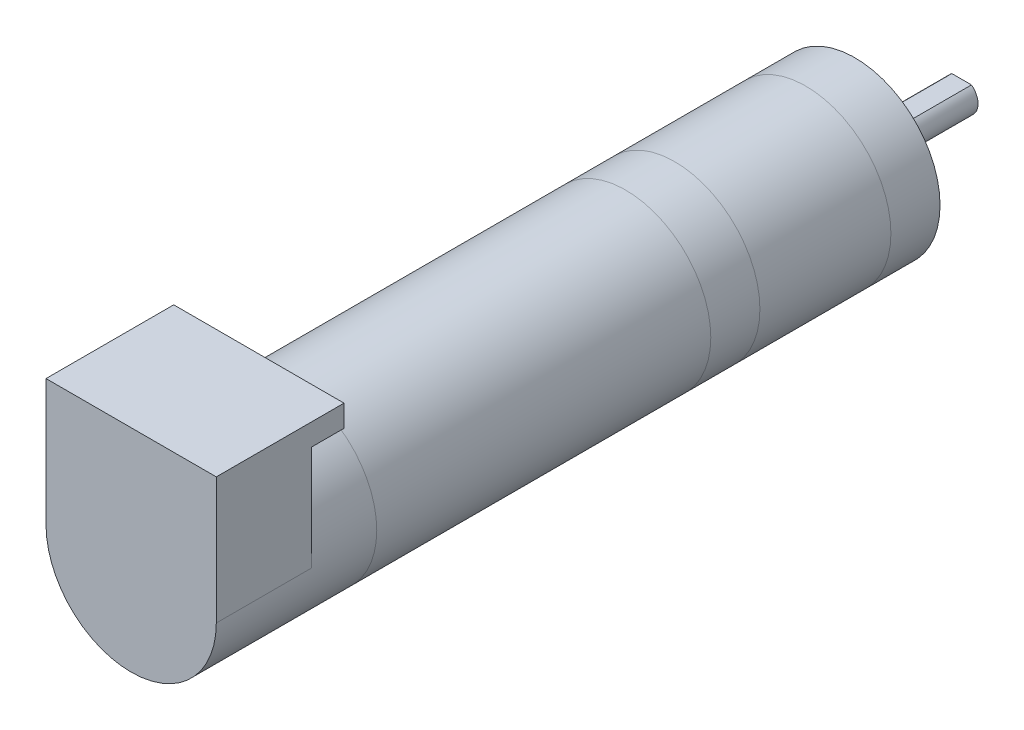
ISO-10303-21;
HEADER;
FILE_DESCRIPTION(('STEP AP214'),'2;1');
FILE_NAME('part.step','',(''),(''),'','','');
FILE_SCHEMA(('AUTOMOTIVE_DESIGN { 1 0 10303 214 1 1 1 1 }'));
ENDSEC;
DATA;
#1=APPLICATION_CONTEXT('core data for automotive mechanical design processes');
#2=APPLICATION_PROTOCOL_DEFINITION('international standard','automotive_design',2000,#1);
#3=PRODUCT_CONTEXT('',#1,'mechanical');
#4=PRODUCT('Part','Part','',(#3));
#5=PRODUCT_RELATED_PRODUCT_CATEGORY('part','',(#4));
#6=PRODUCT_DEFINITION_FORMATION('','',#4);
#7=PRODUCT_DEFINITION_CONTEXT('part definition',#1,'design');
#8=PRODUCT_DEFINITION('design','',#6,#7);
#9=PRODUCT_DEFINITION_SHAPE('','',#8);
#10=(LENGTH_UNIT() NAMED_UNIT(*) SI_UNIT(.MILLI.,.METRE.));
#11=(NAMED_UNIT(*) PLANE_ANGLE_UNIT() SI_UNIT($,.RADIAN.));
#12=(NAMED_UNIT(*) SI_UNIT($,.STERADIAN.) SOLID_ANGLE_UNIT());
#13=UNCERTAINTY_MEASURE_WITH_UNIT(LENGTH_MEASURE(1.E-05),#10,'distance_accuracy_value','');
#14=(GEOMETRIC_REPRESENTATION_CONTEXT(3) GLOBAL_UNCERTAINTY_ASSIGNED_CONTEXT((#13)) GLOBAL_UNIT_ASSIGNED_CONTEXT((#10,
#11,#12)) REPRESENTATION_CONTEXT('',''));
#15=CARTESIAN_POINT('',(0.,0.,0.));
#16=DIRECTION('',(0.,0.,1.));
#17=DIRECTION('',(1.,0.,0.));
#18=AXIS2_PLACEMENT_3D('',#15,#16,#17);
#19=CARTESIAN_POINT('',(0.,0.,96.));
#20=DIRECTION('',(0.,0.,1.));
#21=DIRECTION('',(1.,0.,0.));
#22=AXIS2_PLACEMENT_3D('',#19,#20,#21);
#23=PLANE('',#22);
#24=DIRECTION('',(-1.,0.,0.));
#25=VECTOR('',#24,1.);
#26=CARTESIAN_POINT('',(13.,15.991111634283,96.));
#27=LINE('',#26,#25);
#28=CARTESIAN_POINT('',(13.,15.991111634283,96.));
#29=VERTEX_POINT('',#28);
#30=CARTESIAN_POINT('',(-13.,15.991111634283,96.));
#31=VERTEX_POINT('',#30);
#32=EDGE_CURVE('E130',#29,#31,#27,.T.);
#33=ORIENTED_EDGE('',*,*,#32,.F.);
#34=DIRECTION('',(0.,1.,0.));
#35=VECTOR('',#34,1.);
#36=CARTESIAN_POINT('',(13.,19.321523154119,96.));
#37=LINE('',#36,#35);
#38=CARTESIAN_POINT('',(13.,0.,96.));
#39=VERTEX_POINT('',#38);
#40=EDGE_CURVE('E139',#39,#29,#37,.T.);
#41=ORIENTED_EDGE('',*,*,#40,.F.);
#42=CARTESIAN_POINT('',(0.,0.,96.));
#43=DIRECTION('',(0.,0.,1.));
#44=DIRECTION('',(1.,0.,0.));
#45=AXIS2_PLACEMENT_3D('',#42,#43,#44);
#46=CIRCLE('',#45,13.);
#47=CARTESIAN_POINT('',(-13.,0.,96.));
#48=VERTEX_POINT('',#47);
#49=EDGE_CURVE('E12',#39,#48,#46,.T.);
#50=ORIENTED_EDGE('',*,*,#49,.T.);
#51=DIRECTION('',(0.,-1.,0.));
#52=VECTOR('',#51,1.);
#53=CARTESIAN_POINT('',(-13.,0.,96.));
#54=LINE('',#53,#52);
#55=EDGE_CURVE('E76',#31,#48,#54,.T.);
#56=ORIENTED_EDGE('',*,*,#55,.F.);
#57=EDGE_LOOP('',(#33,#41,#50,#56));
#58=FACE_BOUND('',#57,.T.);
#59=ADVANCED_FACE('F56',(#58),#23,.F.);
#60=CARTESIAN_POINT('',(0.,0.,96.));
#61=DIRECTION('',(0.,0.,-1.));
#62=DIRECTION('',(-1.,0.,0.));
#63=AXIS2_PLACEMENT_3D('',#60,#61,#62);
#64=CYLINDRICAL_SURFACE('',#63,13.);
#65=ORIENTED_EDGE('',*,*,#49,.F.);
#66=DIRECTION('',(0.,0.,-1.));
#67=VECTOR('',#66,1.);
#68=CARTESIAN_POINT('',(13.,0.,110.5));
#69=LINE('',#68,#67);
#70=CARTESIAN_POINT('',(13.,0.,110.5));
#71=VERTEX_POINT('',#70);
#72=EDGE_CURVE('E154',#71,#39,#69,.T.);
#73=ORIENTED_EDGE('',*,*,#72,.F.);
#74=CARTESIAN_POINT('',(0.,0.,110.5));
#75=DIRECTION('',(0.,0.,1.));
#76=DIRECTION('',(1.,0.,0.));
#77=AXIS2_PLACEMENT_3D('',#74,#75,#76);
#78=CIRCLE('',#77,13.);
#79=CARTESIAN_POINT('',(-13.,0.,110.5));
#80=VERTEX_POINT('',#79);
#81=EDGE_CURVE('E140',#80,#71,#78,.T.);
#82=ORIENTED_EDGE('',*,*,#81,.F.);
#83=DIRECTION('',(0.,0.,-1.));
#84=VECTOR('',#83,1.);
#85=CARTESIAN_POINT('',(-13.,0.,110.5));
#86=LINE('',#85,#84);
#87=EDGE_CURVE('E117',#80,#48,#86,.T.);
#88=ORIENTED_EDGE('',*,*,#87,.T.);
#89=EDGE_LOOP('',(#65,#73,#82,#88));
#90=FACE_BOUND('',#89,.T.);
#91=CARTESIAN_POINT('',(0.,0.,86.));
#92=DIRECTION('',(0.,0.,1.));
#93=DIRECTION('',(1.,0.,0.));
#94=AXIS2_PLACEMENT_3D('',#91,#92,#93);
#95=CIRCLE('',#94,13.);
#96=CARTESIAN_POINT('',(13.,0.,86.));
#97=VERTEX_POINT('',#96);
#98=EDGE_CURVE('E60',#97,#97,#95,.T.);
#99=ORIENTED_EDGE('',*,*,#98,.T.);
#100=EDGE_LOOP('',(#99));
#101=FACE_BOUND('',#100,.T.);
#102=ADVANCED_FACE('F58',(#90,#101),#64,.T.);
#103=CARTESIAN_POINT('',(0.,0.,86.));
#104=DIRECTION('',(0.,0.,1.));
#105=DIRECTION('',(1.,0.,0.));
#106=AXIS2_PLACEMENT_3D('',#103,#104,#105);
#107=PLANE('',#106);
#108=ORIENTED_EDGE('',*,*,#98,.F.);
#109=EDGE_LOOP('',(#108));
#110=FACE_BOUND('',#109,.T.);
#111=ADVANCED_FACE('F162',(#110),#107,.F.);
#112=CARTESIAN_POINT('',(13.,19.321523154119,110.5));
#113=DIRECTION('',(-1.,0.,0.));
#114=DIRECTION('',(0.,0.,1.));
#115=AXIS2_PLACEMENT_3D('',#112,#113,#114);
#116=PLANE('',#115);
#117=ORIENTED_EDGE('',*,*,#40,.T.);
#118=DIRECTION('',(0.,0.,1.));
#119=VECTOR('',#118,1.);
#120=CARTESIAN_POINT('',(13.,15.991111634283,91.));
#121=LINE('',#120,#119);
#122=CARTESIAN_POINT('',(13.,15.991111634283,91.));
#123=VERTEX_POINT('',#122);
#124=EDGE_CURVE('E137',#123,#29,#121,.T.);
#125=ORIENTED_EDGE('',*,*,#124,.F.);
#126=DIRECTION('',(0.,-1.,0.));
#127=VECTOR('',#126,1.);
#128=CARTESIAN_POINT('',(13.,15.991111634283,91.));
#129=LINE('',#128,#127);
#130=CARTESIAN_POINT('',(13.,19.321523154119,91.));
#131=VERTEX_POINT('',#130);
#132=EDGE_CURVE('E125',#131,#123,#129,.T.);
#133=ORIENTED_EDGE('',*,*,#132,.F.);
#134=DIRECTION('',(0.,0.,-1.));
#135=VECTOR('',#134,1.);
#136=CARTESIAN_POINT('',(13.,19.321523154119,110.5));
#137=LINE('',#136,#135);
#138=CARTESIAN_POINT('',(13.,19.321523154119,110.5));
#139=VERTEX_POINT('',#138);
#140=EDGE_CURVE('E116',#139,#131,#137,.T.);
#141=ORIENTED_EDGE('',*,*,#140,.F.);
#142=DIRECTION('',(0.,1.,0.));
#143=VECTOR('',#142,1.);
#144=CARTESIAN_POINT('',(13.,19.321523154119,110.5));
#145=LINE('',#144,#143);
#146=EDGE_CURVE('E143',#71,#139,#145,.T.);
#147=ORIENTED_EDGE('',*,*,#146,.F.);
#148=ORIENTED_EDGE('',*,*,#72,.T.);
#149=EDGE_LOOP('',(#117,#125,#133,#141,#147,#148));
#150=FACE_BOUND('',#149,.T.);
#151=ADVANCED_FACE('F164',(#150),#116,.F.);
#152=CARTESIAN_POINT('',(-13.,19.321523154119,110.5));
#153=DIRECTION('',(0.,-1.,0.));
#154=DIRECTION('',(0.,0.,-1.));
#155=AXIS2_PLACEMENT_3D('',#152,#153,#154);
#156=PLANE('',#155);
#157=ORIENTED_EDGE('',*,*,#140,.T.);
#158=DIRECTION('',(1.,0.,0.));
#159=VECTOR('',#158,1.);
#160=CARTESIAN_POINT('',(13.,19.321523154119,91.));
#161=LINE('',#160,#159);
#162=CARTESIAN_POINT('',(-13.,19.321523154119,91.));
#163=VERTEX_POINT('',#162);
#164=EDGE_CURVE('E120',#163,#131,#161,.T.);
#165=ORIENTED_EDGE('',*,*,#164,.F.);
#166=DIRECTION('',(0.,0.,-1.));
#167=VECTOR('',#166,1.);
#168=CARTESIAN_POINT('',(-13.,19.321523154119,110.5));
#169=LINE('',#168,#167);
#170=CARTESIAN_POINT('',(-13.,19.321523154119,110.5));
#171=VERTEX_POINT('',#170);
#172=EDGE_CURVE('E108',#171,#163,#169,.T.);
#173=ORIENTED_EDGE('',*,*,#172,.F.);
#174=DIRECTION('',(-1.,0.,0.));
#175=VECTOR('',#174,1.);
#176=CARTESIAN_POINT('',(-13.,19.321523154119,110.5));
#177=LINE('',#176,#175);
#178=EDGE_CURVE('E145',#139,#171,#177,.T.);
#179=ORIENTED_EDGE('',*,*,#178,.F.);
#180=EDGE_LOOP('',(#157,#165,#173,#179));
#181=FACE_BOUND('',#180,.T.);
#182=ADVANCED_FACE('F121',(#181),#156,.F.);
#183=CARTESIAN_POINT('',(-13.,0.,110.5));
#184=DIRECTION('',(1.,0.,0.));
#185=DIRECTION('',(0.,0.,-1.));
#186=AXIS2_PLACEMENT_3D('',#183,#184,#185);
#187=PLANE('',#186);
#188=ORIENTED_EDGE('',*,*,#172,.T.);
#189=DIRECTION('',(0.,1.,0.));
#190=VECTOR('',#189,1.);
#191=CARTESIAN_POINT('',(-13.,15.991111634283,91.));
#192=LINE('',#191,#190);
#193=CARTESIAN_POINT('',(-13.,15.991111634283,91.));
#194=VERTEX_POINT('',#193);
#195=EDGE_CURVE('E112',#194,#163,#192,.T.);
#196=ORIENTED_EDGE('',*,*,#195,.F.);
#197=DIRECTION('',(0.,0.,1.));
#198=VECTOR('',#197,1.);
#199=CARTESIAN_POINT('',(-13.,15.991111634283,91.));
#200=LINE('',#199,#198);
#201=EDGE_CURVE('E71',#194,#31,#200,.T.);
#202=ORIENTED_EDGE('',*,*,#201,.T.);
#203=ORIENTED_EDGE('',*,*,#55,.T.);
#204=ORIENTED_EDGE('',*,*,#87,.F.);
#205=DIRECTION('',(0.,-1.,0.));
#206=VECTOR('',#205,1.);
#207=CARTESIAN_POINT('',(-13.,0.,110.5));
#208=LINE('',#207,#206);
#209=EDGE_CURVE('E113',#171,#80,#208,.T.);
#210=ORIENTED_EDGE('',*,*,#209,.F.);
#211=EDGE_LOOP('',(#188,#196,#202,#203,#204,#210));
#212=FACE_BOUND('',#211,.T.);
#213=ADVANCED_FACE('F110',(#212),#187,.F.);
#214=CARTESIAN_POINT('',(0.,0.,110.5));
#215=DIRECTION('',(0.,0.,1.));
#216=DIRECTION('',(1.,0.,0.));
#217=AXIS2_PLACEMENT_3D('',#214,#215,#216);
#218=PLANE('',#217);
#219=ORIENTED_EDGE('',*,*,#81,.T.);
#220=ORIENTED_EDGE('',*,*,#146,.T.);
#221=ORIENTED_EDGE('',*,*,#178,.T.);
#222=ORIENTED_EDGE('',*,*,#209,.T.);
#223=EDGE_LOOP('',(#219,#220,#221,#222));
#224=FACE_BOUND('',#223,.T.);
#225=ADVANCED_FACE('F180',(#224),#218,.T.);
#226=CARTESIAN_POINT('',(13.,15.991111634283,91.));
#227=DIRECTION('',(0.,1.,0.));
#228=DIRECTION('',(0.,0.,1.));
#229=AXIS2_PLACEMENT_3D('',#226,#227,#228);
#230=PLANE('',#229);
#231=ORIENTED_EDGE('',*,*,#32,.T.);
#232=ORIENTED_EDGE('',*,*,#201,.F.);
#233=DIRECTION('',(-1.,0.,0.));
#234=VECTOR('',#233,1.);
#235=CARTESIAN_POINT('',(13.,15.991111634283,91.));
#236=LINE('',#235,#234);
#237=EDGE_CURVE('E129',#123,#194,#236,.T.);
#238=ORIENTED_EDGE('',*,*,#237,.F.);
#239=ORIENTED_EDGE('',*,*,#124,.T.);
#240=EDGE_LOOP('',(#231,#232,#238,#239));
#241=FACE_BOUND('',#240,.T.);
#242=ADVANCED_FACE('F199',(#241),#230,.F.);
#243=CARTESIAN_POINT('',(0.,0.,91.));
#244=DIRECTION('',(0.,0.,1.));
#245=DIRECTION('',(1.,0.,0.));
#246=AXIS2_PLACEMENT_3D('',#243,#244,#245);
#247=PLANE('',#246);
#248=ORIENTED_EDGE('',*,*,#195,.T.);
#249=ORIENTED_EDGE('',*,*,#164,.T.);
#250=ORIENTED_EDGE('',*,*,#132,.T.);
#251=ORIENTED_EDGE('',*,*,#237,.T.);
#252=EDGE_LOOP('',(#248,#249,#250,#251));
#253=FACE_BOUND('',#252,.T.);
#254=ADVANCED_FACE('F127',(#253),#247,.F.);
#255=CLOSED_SHELL('',(#59,#102,#111,#151,#182,#213,#225,#242,#254));
#256=MANIFOLD_SOLID_BREP('B2',#255);
#257=CARTESIAN_POINT('',(0.,0.,86.));
#258=DIRECTION('',(0.,0.,-1.));
#259=DIRECTION('',(-1.,0.,0.));
#260=AXIS2_PLACEMENT_3D('',#257,#258,#259);
#261=CYLINDRICAL_SURFACE('',#260,13.);
#262=CARTESIAN_POINT('',(0.,0.,86.));
#263=DIRECTION('',(0.,0.,1.));
#264=DIRECTION('',(1.,0.,0.));
#265=AXIS2_PLACEMENT_3D('',#262,#263,#264);
#266=CIRCLE('',#265,13.);
#267=CARTESIAN_POINT('',(13.,0.,86.));
#268=VERTEX_POINT('',#267);
#269=EDGE_CURVE('E55',#268,#268,#266,.T.);
#270=ORIENTED_EDGE('',*,*,#269,.F.);
#271=EDGE_LOOP('',(#270));
#272=FACE_BOUND('',#271,.T.);
#273=CARTESIAN_POINT('',(0.,0.,35.));
#274=DIRECTION('',(0.,0.,1.));
#275=DIRECTION('',(1.,0.,0.));
#276=AXIS2_PLACEMENT_3D('',#273,#274,#275);
#277=CIRCLE('',#276,13.);
#278=CARTESIAN_POINT('',(13.,0.,35.));
#279=VERTEX_POINT('',#278);
#280=EDGE_CURVE('E318',#279,#279,#277,.T.);
#281=ORIENTED_EDGE('',*,*,#280,.T.);
#282=EDGE_LOOP('',(#281));
#283=FACE_BOUND('',#282,.T.);
#284=ADVANCED_FACE('F315',(#272,#283),#261,.T.);
#285=CARTESIAN_POINT('',(0.,0.,86.));
#286=DIRECTION('',(0.,0.,1.));
#287=DIRECTION('',(1.,0.,0.));
#288=AXIS2_PLACEMENT_3D('',#285,#286,#287);
#289=PLANE('',#288);
#290=ORIENTED_EDGE('',*,*,#269,.T.);
#291=EDGE_LOOP('',(#290));
#292=FACE_BOUND('',#291,.T.);
#293=ADVANCED_FACE('F330',(#292),#289,.T.);
#294=CARTESIAN_POINT('',(0.,0.,35.));
#295=DIRECTION('',(0.,0.,1.));
#296=DIRECTION('',(1.,0.,0.));
#297=AXIS2_PLACEMENT_3D('',#294,#295,#296);
#298=PLANE('',#297);
#299=ORIENTED_EDGE('',*,*,#280,.F.);
#300=EDGE_LOOP('',(#299));
#301=FACE_BOUND('',#300,.T.);
#302=ADVANCED_FACE('F328',(#301),#298,.F.);
#303=CLOSED_SHELL('',(#284,#293,#302));
#304=MANIFOLD_SOLID_BREP('B6',#303);
#305=CARTESIAN_POINT('',(0.,0.,35.));
#306=DIRECTION('',(0.,0.,-1.));
#307=DIRECTION('',(-1.,0.,0.));
#308=AXIS2_PLACEMENT_3D('',#305,#306,#307);
#309=CYLINDRICAL_SURFACE('',#308,13.);
#310=CARTESIAN_POINT('',(0.,0.,35.));
#311=DIRECTION('',(0.,0.,1.));
#312=DIRECTION('',(1.,0.,0.));
#313=AXIS2_PLACEMENT_3D('',#310,#311,#312);
#314=CIRCLE('',#313,13.);
#315=CARTESIAN_POINT('',(13.,0.,35.));
#316=VERTEX_POINT('',#315);
#317=EDGE_CURVE('E314',#316,#316,#314,.T.);
#318=ORIENTED_EDGE('',*,*,#317,.F.);
#319=EDGE_LOOP('',(#318));
#320=FACE_BOUND('',#319,.T.);
#321=CARTESIAN_POINT('',(0.,0.,27.5));
#322=DIRECTION('',(0.,0.,1.));
#323=DIRECTION('',(1.,0.,0.));
#324=AXIS2_PLACEMENT_3D('',#321,#322,#323);
#325=CIRCLE('',#324,13.);
#326=CARTESIAN_POINT('',(13.,0.,27.5));
#327=VERTEX_POINT('',#326);
#328=EDGE_CURVE('E373',#327,#327,#325,.T.);
#329=ORIENTED_EDGE('',*,*,#328,.T.);
#330=EDGE_LOOP('',(#329));
#331=FACE_BOUND('',#330,.T.);
#332=ADVANCED_FACE('F370',(#320,#331),#309,.T.);
#333=CARTESIAN_POINT('',(0.,0.,35.));
#334=DIRECTION('',(0.,0.,1.));
#335=DIRECTION('',(1.,0.,0.));
#336=AXIS2_PLACEMENT_3D('',#333,#334,#335);
#337=PLANE('',#336);
#338=ORIENTED_EDGE('',*,*,#317,.T.);
#339=EDGE_LOOP('',(#338));
#340=FACE_BOUND('',#339,.T.);
#341=ADVANCED_FACE('F385',(#340),#337,.T.);
#342=CARTESIAN_POINT('',(0.,0.,27.5));
#343=DIRECTION('',(0.,0.,1.));
#344=DIRECTION('',(1.,0.,0.));
#345=AXIS2_PLACEMENT_3D('',#342,#343,#344);
#346=PLANE('',#345);
#347=ORIENTED_EDGE('',*,*,#328,.F.);
#348=EDGE_LOOP('',(#347));
#349=FACE_BOUND('',#348,.T.);
#350=ADVANCED_FACE('F383',(#349),#346,.F.);
#351=CLOSED_SHELL('',(#332,#341,#350));
#352=MANIFOLD_SOLID_BREP('B50',#351);
#353=CARTESIAN_POINT('',(0.,0.,27.5));
#354=DIRECTION('',(0.,0.,-1.));
#355=DIRECTION('',(-1.,0.,0.));
#356=AXIS2_PLACEMENT_3D('',#353,#354,#355);
#357=CYLINDRICAL_SURFACE('',#356,13.);
#358=CARTESIAN_POINT('',(0.,0.,27.5));
#359=DIRECTION('',(0.,0.,1.));
#360=DIRECTION('',(1.,0.,0.));
#361=AXIS2_PLACEMENT_3D('',#358,#359,#360);
#362=CIRCLE('',#361,13.);
#363=CARTESIAN_POINT('',(13.,0.,27.5));
#364=VERTEX_POINT('',#363);
#365=EDGE_CURVE('E369',#364,#364,#362,.T.);
#366=ORIENTED_EDGE('',*,*,#365,.F.);
#367=EDGE_LOOP('',(#366));
#368=FACE_BOUND('',#367,.T.);
#369=CARTESIAN_POINT('',(0.,0.,7.5));
#370=DIRECTION('',(0.,0.,1.));
#371=DIRECTION('',(1.,0.,0.));
#372=AXIS2_PLACEMENT_3D('',#369,#370,#371);
#373=CIRCLE('',#372,13.);
#374=CARTESIAN_POINT('',(13.,0.,7.5));
#375=VERTEX_POINT('',#374);
#376=EDGE_CURVE('E429',#375,#375,#373,.T.);
#377=ORIENTED_EDGE('',*,*,#376,.T.);
#378=EDGE_LOOP('',(#377));
#379=FACE_BOUND('',#378,.T.);
#380=ADVANCED_FACE('F426',(#368,#379),#357,.T.);
#381=CARTESIAN_POINT('',(0.,0.,27.5));
#382=DIRECTION('',(0.,0.,1.));
#383=DIRECTION('',(1.,0.,0.));
#384=AXIS2_PLACEMENT_3D('',#381,#382,#383);
#385=PLANE('',#384);
#386=ORIENTED_EDGE('',*,*,#365,.T.);
#387=EDGE_LOOP('',(#386));
#388=FACE_BOUND('',#387,.T.);
#389=ADVANCED_FACE('F441',(#388),#385,.T.);
#390=CARTESIAN_POINT('',(0.,0.,7.5));
#391=DIRECTION('',(0.,0.,1.));
#392=DIRECTION('',(1.,0.,0.));
#393=AXIS2_PLACEMENT_3D('',#390,#391,#392);
#394=PLANE('',#393);
#395=ORIENTED_EDGE('',*,*,#376,.F.);
#396=EDGE_LOOP('',(#395));
#397=FACE_BOUND('',#396,.T.);
#398=ADVANCED_FACE('F439',(#397),#394,.F.);
#399=CLOSED_SHELL('',(#380,#389,#398));
#400=MANIFOLD_SOLID_BREP('B309',#399);
#401=CARTESIAN_POINT('',(0.,0.,7.5));
#402=DIRECTION('',(0.,0.,-1.));
#403=DIRECTION('',(-1.,0.,0.));
#404=AXIS2_PLACEMENT_3D('',#401,#402,#403);
#405=CYLINDRICAL_SURFACE('',#404,13.);
#406=CARTESIAN_POINT('',(0.,0.,7.5));
#407=DIRECTION('',(0.,0.,1.));
#408=DIRECTION('',(1.,0.,0.));
#409=AXIS2_PLACEMENT_3D('',#406,#407,#408);
#410=CIRCLE('',#409,13.);
#411=CARTESIAN_POINT('',(13.,0.,7.5));
#412=VERTEX_POINT('',#411);
#413=EDGE_CURVE('E527',#412,#412,#410,.T.);
#414=ORIENTED_EDGE('',*,*,#413,.F.);
#415=EDGE_LOOP('',(#414));
#416=FACE_BOUND('',#415,.T.);
#417=CARTESIAN_POINT('',(0.,0.,0.));
#418=DIRECTION('',(0.,0.,1.));
#419=DIRECTION('',(1.,0.,0.));
#420=AXIS2_PLACEMENT_3D('',#417,#418,#419);
#421=CIRCLE('',#420,13.);
#422=CARTESIAN_POINT('',(13.,0.,0.));
#423=VERTEX_POINT('',#422);
#424=EDGE_CURVE('E476',#423,#423,#421,.T.);
#425=ORIENTED_EDGE('',*,*,#424,.T.);
#426=EDGE_LOOP('',(#425));
#427=FACE_BOUND('',#426,.T.);
#428=ADVANCED_FACE('F473',(#416,#427),#405,.T.);
#429=CARTESIAN_POINT('',(0.,0.,7.5));
#430=DIRECTION('',(0.,0.,1.));
#431=DIRECTION('',(1.,0.,0.));
#432=AXIS2_PLACEMENT_3D('',#429,#430,#431);
#433=PLANE('',#432);
#434=ORIENTED_EDGE('',*,*,#413,.T.);
#435=EDGE_LOOP('',(#434));
#436=FACE_BOUND('',#435,.T.);
#437=ADVANCED_FACE('F538',(#436),#433,.T.);
#438=CARTESIAN_POINT('',(0.,0.,0.));
#439=DIRECTION('',(0.,0.,1.));
#440=DIRECTION('',(1.,0.,0.));
#441=AXIS2_PLACEMENT_3D('',#438,#439,#440);
#442=PLANE('',#441);
#443=CARTESIAN_POINT('',(0.,0.,0.));
#444=DIRECTION('',(0.,0.,-1.));
#445=DIRECTION('',(-1.,0.,0.));
#446=AXIS2_PLACEMENT_3D('',#443,#444,#445);
#447=CIRCLE('',#446,7.);
#448=CARTESIAN_POINT('',(-7.,0.,0.));
#449=VERTEX_POINT('',#448);
#450=EDGE_CURVE('E481',#449,#449,#447,.T.);
#451=ORIENTED_EDGE('',*,*,#450,.F.);
#452=EDGE_LOOP('',(#451));
#453=FACE_BOUND('',#452,.T.);
#454=ORIENTED_EDGE('',*,*,#424,.F.);
#455=EDGE_LOOP('',(#454));
#456=FACE_BOUND('',#455,.T.);
#457=ADVANCED_FACE('F535',(#453,#456),#442,.F.);
#458=CARTESIAN_POINT('',(0.,0.,-2.));
#459=DIRECTION('',(0.,0.,1.));
#460=DIRECTION('',(1.,0.,0.));
#461=AXIS2_PLACEMENT_3D('',#458,#459,#460);
#462=CYLINDRICAL_SURFACE('',#461,7.);
#463=CARTESIAN_POINT('',(0.,0.,-2.));
#464=DIRECTION('',(0.,0.,-1.));
#465=DIRECTION('',(-1.,0.,0.));
#466=AXIS2_PLACEMENT_3D('',#463,#464,#465);
#467=CIRCLE('',#466,7.);
#468=CARTESIAN_POINT('',(-7.,0.,-2.));
#469=VERTEX_POINT('',#468);
#470=EDGE_CURVE('E522',#469,#469,#467,.T.);
#471=ORIENTED_EDGE('',*,*,#470,.F.);
#472=EDGE_LOOP('',(#471));
#473=FACE_BOUND('',#472,.T.);
#474=ORIENTED_EDGE('',*,*,#450,.T.);
#475=EDGE_LOOP('',(#474));
#476=FACE_BOUND('',#475,.T.);
#477=ADVANCED_FACE('F537',(#473,#476),#462,.T.);
#478=CARTESIAN_POINT('',(0.,0.,-2.));
#479=DIRECTION('',(0.,0.,-1.));
#480=DIRECTION('',(-1.,0.,0.));
#481=AXIS2_PLACEMENT_3D('',#478,#479,#480);
#482=PLANE('',#481);
#483=CARTESIAN_POINT('',(0.,0.,-2.));
#484=DIRECTION('',(0.,0.,-1.));
#485=DIRECTION('',(-1.,0.,0.));
#486=AXIS2_PLACEMENT_3D('',#483,#484,#485);
#487=CIRCLE('',#486,4.);
#488=CARTESIAN_POINT('',(-4.,0.,-2.));
#489=VERTEX_POINT('',#488);
#490=EDGE_CURVE('E424',#489,#489,#487,.T.);
#491=ORIENTED_EDGE('',*,*,#490,.F.);
#492=EDGE_LOOP('',(#491));
#493=FACE_BOUND('',#492,.T.);
#494=ORIENTED_EDGE('',*,*,#470,.T.);
#495=EDGE_LOOP('',(#494));
#496=FACE_BOUND('',#495,.T.);
#497=ADVANCED_FACE('F544',(#493,#496),#482,.T.);
#498=CARTESIAN_POINT('',(0.,0.,-4.5));
#499=DIRECTION('',(0.,0.,1.));
#500=DIRECTION('',(1.,0.,0.));
#501=AXIS2_PLACEMENT_3D('',#498,#499,#500);
#502=CYLINDRICAL_SURFACE('',#501,4.);
#503=CARTESIAN_POINT('',(0.,0.,-4.5));
#504=DIRECTION('',(0.,0.,-1.));
#505=DIRECTION('',(-1.,0.,0.));
#506=AXIS2_PLACEMENT_3D('',#503,#504,#505);
#507=CIRCLE('',#506,4.);
#508=CARTESIAN_POINT('',(-4.,0.,-4.5));
#509=VERTEX_POINT('',#508);
#510=EDGE_CURVE('E517',#509,#509,#507,.T.);
#511=ORIENTED_EDGE('',*,*,#510,.F.);
#512=EDGE_LOOP('',(#511));
#513=FACE_BOUND('',#512,.T.);
#514=ORIENTED_EDGE('',*,*,#490,.T.);
#515=EDGE_LOOP('',(#514));
#516=FACE_BOUND('',#515,.T.);
#517=ADVANCED_FACE('F575',(#513,#516),#502,.T.);
#518=CARTESIAN_POINT('',(0.,0.,-4.5));
#519=DIRECTION('',(0.,0.,-1.));
#520=DIRECTION('',(-1.,0.,0.));
#521=AXIS2_PLACEMENT_3D('',#518,#519,#520);
#522=PLANE('',#521);
#523=CARTESIAN_POINT('',(0.,0.,-4.5));
#524=DIRECTION('',(0.,0.,-1.));
#525=DIRECTION('',(-1.,0.,0.));
#526=AXIS2_PLACEMENT_3D('',#523,#524,#525);
#527=CIRCLE('',#526,2.5);
#528=CARTESIAN_POINT('',(1.5,2.,-4.5));
#529=VERTEX_POINT('',#528);
#530=CARTESIAN_POINT('',(-1.5,2.,-4.5));
#531=VERTEX_POINT('',#530);
#532=EDGE_CURVE('E501',#529,#531,#527,.T.);
#533=ORIENTED_EDGE('',*,*,#532,.F.);
#534=DIRECTION('',(1.,0.,0.));
#535=VECTOR('',#534,1.);
#536=CARTESIAN_POINT('',(1.5,2.,-4.5));
#537=LINE('',#536,#535);
#538=EDGE_CURVE('E488',#531,#529,#537,.T.);
#539=ORIENTED_EDGE('',*,*,#538,.F.);
#540=EDGE_LOOP('',(#533,#539));
#541=FACE_BOUND('',#540,.T.);
#542=ORIENTED_EDGE('',*,*,#510,.T.);
#543=EDGE_LOOP('',(#542));
#544=FACE_BOUND('',#543,.T.);
#545=ADVANCED_FACE('F502',(#541,#544),#522,.T.);
#546=CARTESIAN_POINT('',(0.,0.,-16.3));
#547=DIRECTION('',(0.,0.,1.));
#548=DIRECTION('',(1.,0.,0.));
#549=AXIS2_PLACEMENT_3D('',#546,#547,#548);
#550=CYLINDRICAL_SURFACE('',#549,2.5);
#551=ORIENTED_EDGE('',*,*,#532,.T.);
#552=DIRECTION('',(0.,0.,1.));
#553=VECTOR('',#552,1.);
#554=CARTESIAN_POINT('',(-1.5,2.,-16.3));
#555=LINE('',#554,#553);
#556=CARTESIAN_POINT('',(-1.5,2.,-16.3));
#557=VERTEX_POINT('',#556);
#558=EDGE_CURVE('E512',#557,#531,#555,.T.);
#559=ORIENTED_EDGE('',*,*,#558,.F.);
#560=CARTESIAN_POINT('',(0.,0.,-16.3));
#561=DIRECTION('',(0.,0.,-1.));
#562=DIRECTION('',(-1.,0.,0.));
#563=AXIS2_PLACEMENT_3D('',#560,#561,#562);
#564=CIRCLE('',#563,2.5);
#565=CARTESIAN_POINT('',(1.5,2.,-16.3));
#566=VERTEX_POINT('',#565);
#567=EDGE_CURVE('E513',#566,#557,#564,.T.);
#568=ORIENTED_EDGE('',*,*,#567,.F.);
#569=DIRECTION('',(0.,0.,1.));
#570=VECTOR('',#569,1.);
#571=CARTESIAN_POINT('',(1.5,2.,-16.3));
#572=LINE('',#571,#570);
#573=EDGE_CURVE('E510',#566,#529,#572,.T.);
#574=ORIENTED_EDGE('',*,*,#573,.T.);
#575=EDGE_LOOP('',(#551,#559,#568,#574));
#576=FACE_BOUND('',#575,.T.);
#577=ADVANCED_FACE('F515',(#576),#550,.T.);
#578=CARTESIAN_POINT('',(1.5,2.,-16.3));
#579=DIRECTION('',(0.,-1.,0.));
#580=DIRECTION('',(1.,0.,0.));
#581=AXIS2_PLACEMENT_3D('',#578,#579,#580);
#582=PLANE('',#581);
#583=ORIENTED_EDGE('',*,*,#538,.T.);
#584=ORIENTED_EDGE('',*,*,#573,.F.);
#585=DIRECTION('',(1.,0.,0.));
#586=VECTOR('',#585,1.);
#587=CARTESIAN_POINT('',(1.5,2.,-16.3));
#588=LINE('',#587,#586);
#589=EDGE_CURVE('E496',#557,#566,#588,.T.);
#590=ORIENTED_EDGE('',*,*,#589,.F.);
#591=ORIENTED_EDGE('',*,*,#558,.T.);
#592=EDGE_LOOP('',(#583,#584,#590,#591));
#593=FACE_BOUND('',#592,.T.);
#594=ADVANCED_FACE('F509',(#593),#582,.F.);
#595=CARTESIAN_POINT('',(0.,0.,-16.3));
#596=DIRECTION('',(0.,0.,-1.));
#597=DIRECTION('',(-1.,0.,0.));
#598=AXIS2_PLACEMENT_3D('',#595,#596,#597);
#599=PLANE('',#598);
#600=ORIENTED_EDGE('',*,*,#567,.T.);
#601=ORIENTED_EDGE('',*,*,#589,.T.);
#602=EDGE_LOOP('',(#600,#601));
#603=FACE_BOUND('',#602,.T.);
#604=ADVANCED_FACE('F607',(#603),#599,.T.);
#605=CLOSED_SHELL('',(#428,#437,#457,#477,#497,#517,#545,#577,#594,#604));
#606=MANIFOLD_SOLID_BREP('B364',#605);
#607=ADVANCED_BREP_SHAPE_REPRESENTATION('',(#18,#256,#304,#352,#400,#606),#14);
#608=SHAPE_DEFINITION_REPRESENTATION(#9,#607);
ENDSEC;
END-ISO-10303-21;
